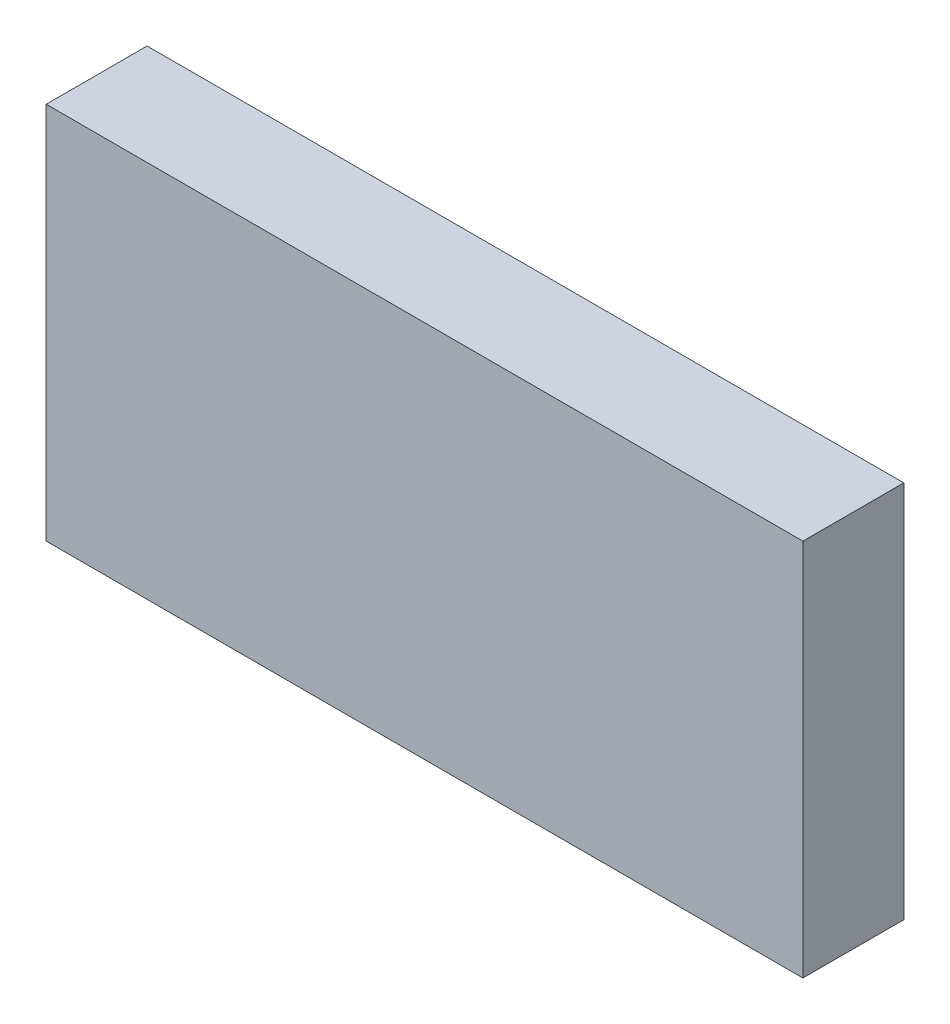
ISO-10303-21;
HEADER;
FILE_DESCRIPTION(('STEP AP214'),'2;1');
FILE_NAME('part.step','',(''),(''),'','','');
FILE_SCHEMA(('AUTOMOTIVE_DESIGN { 1 0 10303 214 1 1 1 1 }'));
ENDSEC;
DATA;
#1=APPLICATION_CONTEXT('core data for automotive mechanical design processes');
#2=APPLICATION_PROTOCOL_DEFINITION('international standard','automotive_design',2000,#1);
#3=PRODUCT_CONTEXT('',#1,'mechanical');
#4=PRODUCT('Part','Part','',(#3));
#5=PRODUCT_RELATED_PRODUCT_CATEGORY('part','',(#4));
#6=PRODUCT_DEFINITION_FORMATION('','',#4);
#7=PRODUCT_DEFINITION_CONTEXT('part definition',#1,'design');
#8=PRODUCT_DEFINITION('design','',#6,#7);
#9=PRODUCT_DEFINITION_SHAPE('','',#8);
#10=(LENGTH_UNIT() NAMED_UNIT(*) SI_UNIT(.MILLI.,.METRE.));
#11=(NAMED_UNIT(*) PLANE_ANGLE_UNIT() SI_UNIT($,.RADIAN.));
#12=(NAMED_UNIT(*) SI_UNIT($,.STERADIAN.) SOLID_ANGLE_UNIT());
#13=UNCERTAINTY_MEASURE_WITH_UNIT(LENGTH_MEASURE(1.E-05),#10,'distance_accuracy_value','');
#14=(GEOMETRIC_REPRESENTATION_CONTEXT(3) GLOBAL_UNCERTAINTY_ASSIGNED_CONTEXT((#13)) GLOBAL_UNIT_ASSIGNED_CONTEXT((#10,
#11,#12)) REPRESENTATION_CONTEXT('',''));
#15=CARTESIAN_POINT('',(0.,0.,0.));
#16=DIRECTION('',(0.,0.,1.));
#17=DIRECTION('',(1.,0.,0.));
#18=AXIS2_PLACEMENT_3D('',#15,#16,#17);
#19=CARTESIAN_POINT('',(0.,30.,8.));
#20=DIRECTION('',(1.,0.,0.));
#21=DIRECTION('',(0.,0.,-1.));
#22=AXIS2_PLACEMENT_3D('',#19,#20,#21);
#23=PLANE('',#22);
#24=DIRECTION('',(0.,-1.,0.));
#25=VECTOR('',#24,1.);
#26=CARTESIAN_POINT('',(0.,30.,0.));
#27=LINE('',#26,#25);
#28=CARTESIAN_POINT('',(0.,30.,0.));
#29=VERTEX_POINT('',#28);
#30=CARTESIAN_POINT('',(0.,0.,0.));
#31=VERTEX_POINT('',#30);
#32=EDGE_CURVE('E102',#29,#31,#27,.T.);
#33=ORIENTED_EDGE('',*,*,#32,.T.);
#34=DIRECTION('',(0.,0.,-1.));
#35=VECTOR('',#34,1.);
#36=CARTESIAN_POINT('',(0.,0.,8.));
#37=LINE('',#36,#35);
#38=CARTESIAN_POINT('',(0.,0.,8.));
#39=VERTEX_POINT('',#38);
#40=EDGE_CURVE('E11',#39,#31,#37,.T.);
#41=ORIENTED_EDGE('',*,*,#40,.F.);
#42=DIRECTION('',(0.,-1.,0.));
#43=VECTOR('',#42,1.);
#44=CARTESIAN_POINT('',(0.,30.,8.));
#45=LINE('',#44,#43);
#46=CARTESIAN_POINT('',(0.,30.,8.));
#47=VERTEX_POINT('',#46);
#48=EDGE_CURVE('E90',#47,#39,#45,.T.);
#49=ORIENTED_EDGE('',*,*,#48,.F.);
#50=DIRECTION('',(0.,0.,-1.));
#51=VECTOR('',#50,1.);
#52=CARTESIAN_POINT('',(0.,30.,8.));
#53=LINE('',#52,#51);
#54=EDGE_CURVE('E98',#47,#29,#53,.T.);
#55=ORIENTED_EDGE('',*,*,#54,.T.);
#56=EDGE_LOOP('',(#33,#41,#49,#55));
#57=FACE_BOUND('',#56,.T.);
#58=ADVANCED_FACE('F39',(#57),#23,.F.);
#59=CARTESIAN_POINT('',(0.,0.,8.));
#60=DIRECTION('',(0.,1.,0.));
#61=DIRECTION('',(0.,0.,1.));
#62=AXIS2_PLACEMENT_3D('',#59,#60,#61);
#63=PLANE('',#62);
#64=DIRECTION('',(1.,0.,0.));
#65=VECTOR('',#64,1.);
#66=CARTESIAN_POINT('',(0.,0.,0.));
#67=LINE('',#66,#65);
#68=CARTESIAN_POINT('',(60.,0.,0.));
#69=VERTEX_POINT('',#68);
#70=EDGE_CURVE('E94',#31,#69,#67,.T.);
#71=ORIENTED_EDGE('',*,*,#70,.T.);
#72=DIRECTION('',(0.,0.,-1.));
#73=VECTOR('',#72,1.);
#74=CARTESIAN_POINT('',(60.,0.,8.));
#75=LINE('',#74,#73);
#76=CARTESIAN_POINT('',(60.,0.,8.));
#77=VERTEX_POINT('',#76);
#78=EDGE_CURVE('E47',#77,#69,#75,.T.);
#79=ORIENTED_EDGE('',*,*,#78,.F.);
#80=DIRECTION('',(1.,0.,0.));
#81=VECTOR('',#80,1.);
#82=CARTESIAN_POINT('',(0.,0.,8.));
#83=LINE('',#82,#81);
#84=EDGE_CURVE('E85',#39,#77,#83,.T.);
#85=ORIENTED_EDGE('',*,*,#84,.F.);
#86=ORIENTED_EDGE('',*,*,#40,.T.);
#87=EDGE_LOOP('',(#71,#79,#85,#86));
#88=FACE_BOUND('',#87,.T.);
#89=ADVANCED_FACE('F93',(#88),#63,.F.);
#90=CARTESIAN_POINT('',(60.,0.,8.));
#91=DIRECTION('',(-1.,0.,0.));
#92=DIRECTION('',(0.,0.,1.));
#93=AXIS2_PLACEMENT_3D('',#90,#91,#92);
#94=PLANE('',#93);
#95=DIRECTION('',(0.,1.,0.));
#96=VECTOR('',#95,1.);
#97=CARTESIAN_POINT('',(60.,0.,0.));
#98=LINE('',#97,#96);
#99=CARTESIAN_POINT('',(60.,30.,0.));
#100=VERTEX_POINT('',#99);
#101=EDGE_CURVE('E72',#69,#100,#98,.T.);
#102=ORIENTED_EDGE('',*,*,#101,.T.);
#103=DIRECTION('',(0.,0.,-1.));
#104=VECTOR('',#103,1.);
#105=CARTESIAN_POINT('',(60.,30.,8.));
#106=LINE('',#105,#104);
#107=CARTESIAN_POINT('',(60.,30.,8.));
#108=VERTEX_POINT('',#107);
#109=EDGE_CURVE('E95',#108,#100,#106,.T.);
#110=ORIENTED_EDGE('',*,*,#109,.F.);
#111=DIRECTION('',(0.,1.,0.));
#112=VECTOR('',#111,1.);
#113=CARTESIAN_POINT('',(60.,0.,8.));
#114=LINE('',#113,#112);
#115=EDGE_CURVE('E88',#77,#108,#114,.T.);
#116=ORIENTED_EDGE('',*,*,#115,.F.);
#117=ORIENTED_EDGE('',*,*,#78,.T.);
#118=EDGE_LOOP('',(#102,#110,#116,#117));
#119=FACE_BOUND('',#118,.T.);
#120=ADVANCED_FACE('F96',(#119),#94,.F.);
#121=CARTESIAN_POINT('',(60.,30.,8.));
#122=DIRECTION('',(0.,-1.,0.));
#123=DIRECTION('',(0.,0.,-1.));
#124=AXIS2_PLACEMENT_3D('',#121,#122,#123);
#125=PLANE('',#124);
#126=DIRECTION('',(-1.,0.,0.));
#127=VECTOR('',#126,1.);
#128=CARTESIAN_POINT('',(60.,30.,0.));
#129=LINE('',#128,#127);
#130=EDGE_CURVE('E78',#100,#29,#129,.T.);
#131=ORIENTED_EDGE('',*,*,#130,.T.);
#132=ORIENTED_EDGE('',*,*,#54,.F.);
#133=DIRECTION('',(-1.,0.,0.));
#134=VECTOR('',#133,1.);
#135=CARTESIAN_POINT('',(60.,30.,8.));
#136=LINE('',#135,#134);
#137=EDGE_CURVE('E55',#108,#47,#136,.T.);
#138=ORIENTED_EDGE('',*,*,#137,.F.);
#139=ORIENTED_EDGE('',*,*,#109,.T.);
#140=EDGE_LOOP('',(#131,#132,#138,#139));
#141=FACE_BOUND('',#140,.T.);
#142=ADVANCED_FACE('F109',(#141),#125,.F.);
#143=CARTESIAN_POINT('',(0.,0.,8.));
#144=DIRECTION('',(0.,0.,1.));
#145=DIRECTION('',(1.,0.,0.));
#146=AXIS2_PLACEMENT_3D('',#143,#144,#145);
#147=PLANE('',#146);
#148=ORIENTED_EDGE('',*,*,#48,.T.);
#149=ORIENTED_EDGE('',*,*,#84,.T.);
#150=ORIENTED_EDGE('',*,*,#115,.T.);
#151=ORIENTED_EDGE('',*,*,#137,.T.);
#152=EDGE_LOOP('',(#148,#149,#150,#151));
#153=FACE_BOUND('',#152,.T.);
#154=ADVANCED_FACE('F86',(#153),#147,.T.);
#155=CARTESIAN_POINT('',(0.,0.,0.));
#156=DIRECTION('',(0.,0.,1.));
#157=DIRECTION('',(1.,0.,0.));
#158=AXIS2_PLACEMENT_3D('',#155,#156,#157);
#159=PLANE('',#158);
#160=ORIENTED_EDGE('',*,*,#32,.F.);
#161=ORIENTED_EDGE('',*,*,#130,.F.);
#162=ORIENTED_EDGE('',*,*,#101,.F.);
#163=ORIENTED_EDGE('',*,*,#70,.F.);
#164=EDGE_LOOP('',(#160,#161,#162,#163));
#165=FACE_BOUND('',#164,.T.);
#166=ADVANCED_FACE('F112',(#165),#159,.F.);
#167=CLOSED_SHELL('',(#58,#89,#120,#142,#154,#166));
#168=MANIFOLD_SOLID_BREP('B2',#167);
#169=ADVANCED_BREP_SHAPE_REPRESENTATION('',(#18,#168),#14);
#170=SHAPE_DEFINITION_REPRESENTATION(#9,#169);
ENDSEC;
END-ISO-10303-21;
